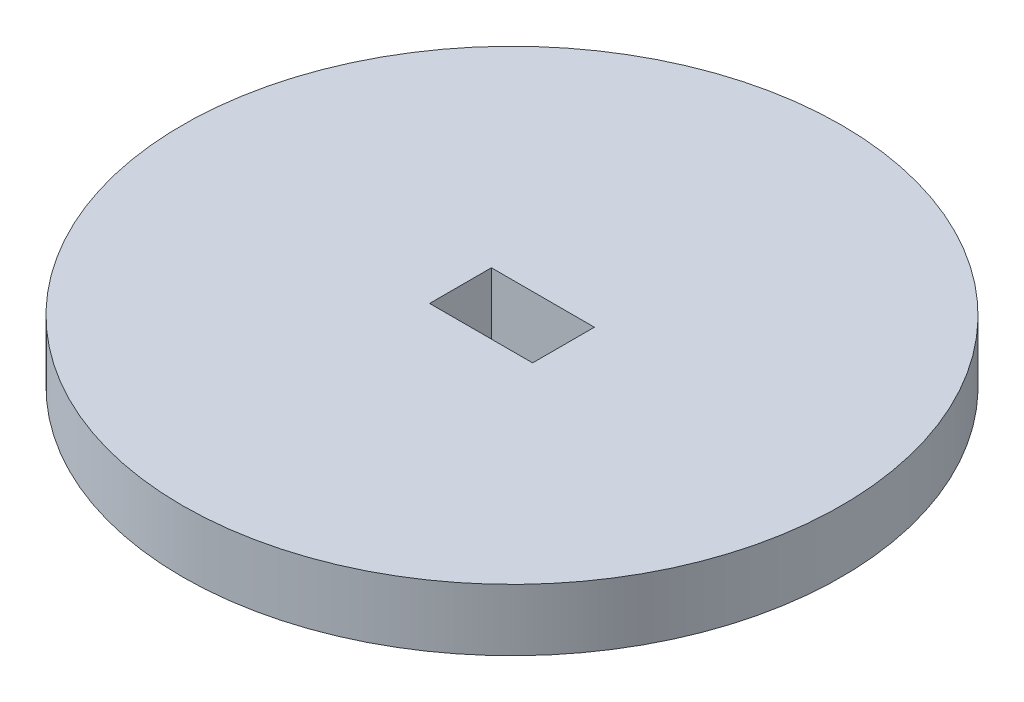
ISO-10303-21;
HEADER;
FILE_DESCRIPTION(('STEP AP214'),'2;1');
FILE_NAME('part.step','',(''),(''),'','','');
FILE_SCHEMA(('AUTOMOTIVE_DESIGN { 1 0 10303 214 1 1 1 1 }'));
ENDSEC;
DATA;
#1=APPLICATION_CONTEXT('core data for automotive mechanical design processes');
#2=APPLICATION_PROTOCOL_DEFINITION('international standard','automotive_design',2000,#1);
#3=PRODUCT_CONTEXT('',#1,'mechanical');
#4=PRODUCT('Part','Part','',(#3));
#5=PRODUCT_RELATED_PRODUCT_CATEGORY('part','',(#4));
#6=PRODUCT_DEFINITION_FORMATION('','',#4);
#7=PRODUCT_DEFINITION_CONTEXT('part definition',#1,'design');
#8=PRODUCT_DEFINITION('design','',#6,#7);
#9=PRODUCT_DEFINITION_SHAPE('','',#8);
#10=(LENGTH_UNIT() NAMED_UNIT(*) SI_UNIT(.MILLI.,.METRE.));
#11=(NAMED_UNIT(*) PLANE_ANGLE_UNIT() SI_UNIT($,.RADIAN.));
#12=(NAMED_UNIT(*) SI_UNIT($,.STERADIAN.) SOLID_ANGLE_UNIT());
#13=UNCERTAINTY_MEASURE_WITH_UNIT(LENGTH_MEASURE(1.E-05),#10,'distance_accuracy_value','');
#14=(GEOMETRIC_REPRESENTATION_CONTEXT(3) GLOBAL_UNCERTAINTY_ASSIGNED_CONTEXT((#13)) GLOBAL_UNIT_ASSIGNED_CONTEXT((#10,
#11,#12)) REPRESENTATION_CONTEXT('',''));
#15=CARTESIAN_POINT('',(0.,0.,0.));
#16=DIRECTION('',(0.,0.,1.));
#17=DIRECTION('',(1.,0.,0.));
#18=AXIS2_PLACEMENT_3D('',#15,#16,#17);
#19=CARTESIAN_POINT('',(0.,6.,0.));
#20=DIRECTION('',(0.,-1.,0.));
#21=DIRECTION('',(0.,0.,-1.));
#22=AXIS2_PLACEMENT_3D('',#19,#20,#21);
#23=CYLINDRICAL_SURFACE('',#22,32.);
#24=CARTESIAN_POINT('',(0.,6.,0.));
#25=DIRECTION('',(0.,1.,0.));
#26=DIRECTION('',(0.,0.,1.));
#27=AXIS2_PLACEMENT_3D('',#24,#25,#26);
#28=CIRCLE('',#27,32.);
#29=CARTESIAN_POINT('',(0.,6.,32.));
#30=VERTEX_POINT('',#29);
#31=EDGE_CURVE('E11',#30,#30,#28,.T.);
#32=ORIENTED_EDGE('',*,*,#31,.F.);
#33=EDGE_LOOP('',(#32));
#34=FACE_BOUND('',#33,.T.);
#35=CARTESIAN_POINT('',(0.,0.,0.));
#36=DIRECTION('',(0.,1.,0.));
#37=DIRECTION('',(0.,0.,1.));
#38=AXIS2_PLACEMENT_3D('',#35,#36,#37);
#39=CIRCLE('',#38,32.);
#40=CARTESIAN_POINT('',(0.,0.,32.));
#41=VERTEX_POINT('',#40);
#42=EDGE_CURVE('E37',#41,#41,#39,.T.);
#43=ORIENTED_EDGE('',*,*,#42,.T.);
#44=EDGE_LOOP('',(#43));
#45=FACE_BOUND('',#44,.T.);
#46=ADVANCED_FACE('F34',(#34,#45),#23,.T.);
#47=CARTESIAN_POINT('',(0.,6.,0.));
#48=DIRECTION('',(0.,1.,0.));
#49=DIRECTION('',(0.,0.,1.));
#50=AXIS2_PLACEMENT_3D('',#47,#48,#49);
#51=PLANE('',#50);
#52=DIRECTION('',(0.,0.,1.));
#53=VECTOR('',#52,1.);
#54=CARTESIAN_POINT('',(-5.,6.,3.));
#55=LINE('',#54,#53);
#56=CARTESIAN_POINT('',(-5.,6.,-3.));
#57=VERTEX_POINT('',#56);
#58=CARTESIAN_POINT('',(-5.,6.,3.));
#59=VERTEX_POINT('',#58);
#60=EDGE_CURVE('E48',#57,#59,#55,.T.);
#61=ORIENTED_EDGE('',*,*,#60,.F.);
#62=DIRECTION('',(-1.,0.,0.));
#63=VECTOR('',#62,1.);
#64=CARTESIAN_POINT('',(5.,6.,-3.));
#65=LINE('',#64,#63);
#66=CARTESIAN_POINT('',(5.,6.,-3.));
#67=VERTEX_POINT('',#66);
#68=EDGE_CURVE('E92',#67,#57,#65,.T.);
#69=ORIENTED_EDGE('',*,*,#68,.F.);
#70=DIRECTION('',(0.,0.,-1.));
#71=VECTOR('',#70,1.);
#72=CARTESIAN_POINT('',(5.,6.,3.));
#73=LINE('',#72,#71);
#74=CARTESIAN_POINT('',(5.,6.,3.));
#75=VERTEX_POINT('',#74);
#76=EDGE_CURVE('E95',#75,#67,#73,.T.);
#77=ORIENTED_EDGE('',*,*,#76,.F.);
#78=DIRECTION('',(1.,0.,0.));
#79=VECTOR('',#78,1.);
#80=CARTESIAN_POINT('',(5.,6.,3.));
#81=LINE('',#80,#79);
#82=EDGE_CURVE('E101',#59,#75,#81,.T.);
#83=ORIENTED_EDGE('',*,*,#82,.F.);
#84=EDGE_LOOP('',(#61,#69,#77,#83));
#85=FACE_BOUND('',#84,.T.);
#86=ORIENTED_EDGE('',*,*,#31,.T.);
#87=EDGE_LOOP('',(#86));
#88=FACE_BOUND('',#87,.T.);
#89=ADVANCED_FACE('F113',(#85,#88),#51,.T.);
#90=CARTESIAN_POINT('',(0.,0.,0.));
#91=DIRECTION('',(0.,1.,0.));
#92=DIRECTION('',(0.,0.,1.));
#93=AXIS2_PLACEMENT_3D('',#90,#91,#92);
#94=PLANE('',#93);
#95=DIRECTION('',(-1.,0.,0.));
#96=VECTOR('',#95,1.);
#97=CARTESIAN_POINT('',(5.,0.,-3.));
#98=LINE('',#97,#96);
#99=CARTESIAN_POINT('',(5.,0.,-3.));
#100=VERTEX_POINT('',#99);
#101=CARTESIAN_POINT('',(-5.,0.,-3.));
#102=VERTEX_POINT('',#101);
#103=EDGE_CURVE('E82',#100,#102,#98,.T.);
#104=ORIENTED_EDGE('',*,*,#103,.T.);
#105=DIRECTION('',(0.,0.,1.));
#106=VECTOR('',#105,1.);
#107=CARTESIAN_POINT('',(-5.,0.,3.));
#108=LINE('',#107,#106);
#109=CARTESIAN_POINT('',(-5.,0.,3.));
#110=VERTEX_POINT('',#109);
#111=EDGE_CURVE('E76',#102,#110,#108,.T.);
#112=ORIENTED_EDGE('',*,*,#111,.T.);
#113=DIRECTION('',(1.,0.,0.));
#114=VECTOR('',#113,1.);
#115=CARTESIAN_POINT('',(5.,0.,3.));
#116=LINE('',#115,#114);
#117=CARTESIAN_POINT('',(5.,0.,3.));
#118=VERTEX_POINT('',#117);
#119=EDGE_CURVE('E85',#110,#118,#116,.T.);
#120=ORIENTED_EDGE('',*,*,#119,.T.);
#121=DIRECTION('',(0.,0.,-1.));
#122=VECTOR('',#121,1.);
#123=CARTESIAN_POINT('',(5.,0.,3.));
#124=LINE('',#123,#122);
#125=EDGE_CURVE('E56',#118,#100,#124,.T.);
#126=ORIENTED_EDGE('',*,*,#125,.T.);
#127=EDGE_LOOP('',(#104,#112,#120,#126));
#128=FACE_BOUND('',#127,.T.);
#129=ORIENTED_EDGE('',*,*,#42,.F.);
#130=EDGE_LOOP('',(#129));
#131=FACE_BOUND('',#130,.T.);
#132=ADVANCED_FACE('F89',(#128,#131),#94,.F.);
#133=CARTESIAN_POINT('',(-5.,0.,3.));
#134=DIRECTION('',(-1.,0.,0.));
#135=DIRECTION('',(0.,0.,1.));
#136=AXIS2_PLACEMENT_3D('',#133,#134,#135);
#137=PLANE('',#136);
#138=ORIENTED_EDGE('',*,*,#60,.T.);
#139=DIRECTION('',(0.,1.,0.));
#140=VECTOR('',#139,1.);
#141=CARTESIAN_POINT('',(-5.,0.,3.));
#142=LINE('',#141,#140);
#143=EDGE_CURVE('E72',#110,#59,#142,.T.);
#144=ORIENTED_EDGE('',*,*,#143,.F.);
#145=ORIENTED_EDGE('',*,*,#111,.F.);
#146=DIRECTION('',(0.,1.,0.));
#147=VECTOR('',#146,1.);
#148=CARTESIAN_POINT('',(-5.,0.,-3.));
#149=LINE('',#148,#147);
#150=EDGE_CURVE('E105',#102,#57,#149,.T.);
#151=ORIENTED_EDGE('',*,*,#150,.T.);
#152=EDGE_LOOP('',(#138,#144,#145,#151));
#153=FACE_BOUND('',#152,.T.);
#154=ADVANCED_FACE('F74',(#153),#137,.F.);
#155=CARTESIAN_POINT('',(5.,0.,-3.));
#156=DIRECTION('',(0.,0.,-1.));
#157=DIRECTION('',(-1.,0.,0.));
#158=AXIS2_PLACEMENT_3D('',#155,#156,#157);
#159=PLANE('',#158);
#160=ORIENTED_EDGE('',*,*,#68,.T.);
#161=ORIENTED_EDGE('',*,*,#150,.F.);
#162=ORIENTED_EDGE('',*,*,#103,.F.);
#163=DIRECTION('',(0.,1.,0.));
#164=VECTOR('',#163,1.);
#165=CARTESIAN_POINT('',(5.,0.,-3.));
#166=LINE('',#165,#164);
#167=EDGE_CURVE('E107',#100,#67,#166,.T.);
#168=ORIENTED_EDGE('',*,*,#167,.T.);
#169=EDGE_LOOP('',(#160,#161,#162,#168));
#170=FACE_BOUND('',#169,.T.);
#171=ADVANCED_FACE('F116',(#170),#159,.F.);
#172=CARTESIAN_POINT('',(5.,0.,3.));
#173=DIRECTION('',(1.,0.,0.));
#174=DIRECTION('',(0.,0.,-1.));
#175=AXIS2_PLACEMENT_3D('',#172,#173,#174);
#176=PLANE('',#175);
#177=ORIENTED_EDGE('',*,*,#76,.T.);
#178=ORIENTED_EDGE('',*,*,#167,.F.);
#179=ORIENTED_EDGE('',*,*,#125,.F.);
#180=DIRECTION('',(0.,1.,0.));
#181=VECTOR('',#180,1.);
#182=CARTESIAN_POINT('',(5.,0.,3.));
#183=LINE('',#182,#181);
#184=EDGE_CURVE('E81',#118,#75,#183,.T.);
#185=ORIENTED_EDGE('',*,*,#184,.T.);
#186=EDGE_LOOP('',(#177,#178,#179,#185));
#187=FACE_BOUND('',#186,.T.);
#188=ADVANCED_FACE('F109',(#187),#176,.F.);
#189=CARTESIAN_POINT('',(5.,0.,3.));
#190=DIRECTION('',(0.,0.,1.));
#191=DIRECTION('',(1.,0.,0.));
#192=AXIS2_PLACEMENT_3D('',#189,#190,#191);
#193=PLANE('',#192);
#194=ORIENTED_EDGE('',*,*,#82,.T.);
#195=ORIENTED_EDGE('',*,*,#184,.F.);
#196=ORIENTED_EDGE('',*,*,#119,.F.);
#197=ORIENTED_EDGE('',*,*,#143,.T.);
#198=EDGE_LOOP('',(#194,#195,#196,#197));
#199=FACE_BOUND('',#198,.T.);
#200=ADVANCED_FACE('F86',(#199),#193,.F.);
#201=CLOSED_SHELL('',(#46,#89,#132,#154,#171,#188,#200));
#202=MANIFOLD_SOLID_BREP('B2',#201);
#203=ADVANCED_BREP_SHAPE_REPRESENTATION('',(#18,#202),#14);
#204=SHAPE_DEFINITION_REPRESENTATION(#9,#203);
ENDSEC;
END-ISO-10303-21;
